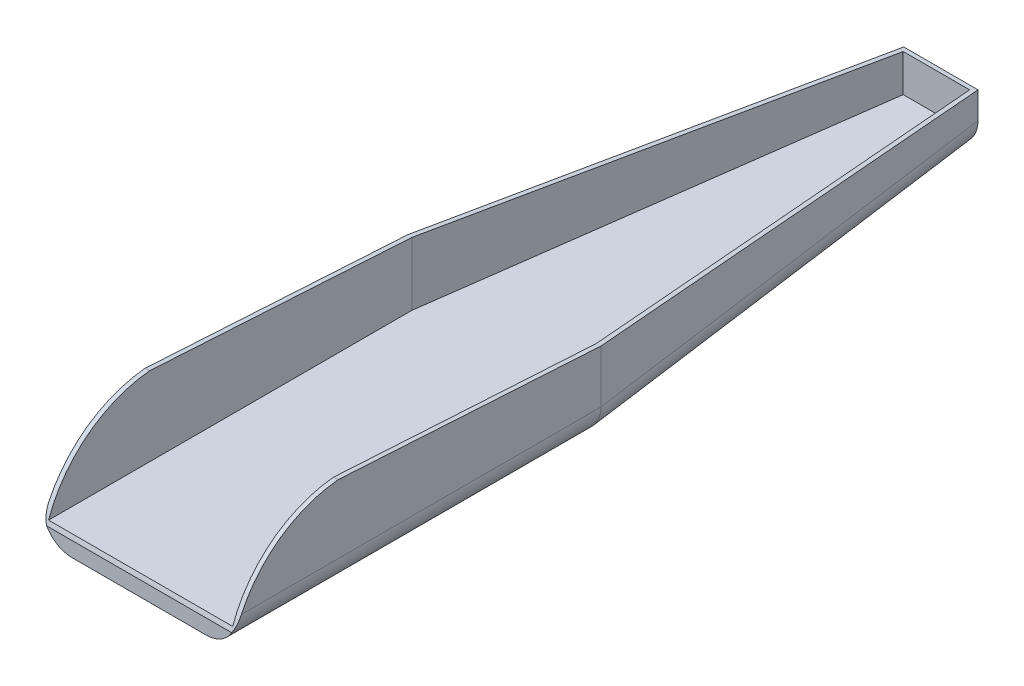
ISO-10303-21;
HEADER;
FILE_DESCRIPTION(('STEP AP214'),'2;1');
FILE_NAME('part.step','',(''),(''),'','','');
FILE_SCHEMA(('AUTOMOTIVE_DESIGN { 1 0 10303 214 1 1 1 1 }'));
ENDSEC;
DATA;
#1=APPLICATION_CONTEXT('core data for automotive mechanical design processes');
#2=APPLICATION_PROTOCOL_DEFINITION('international standard','automotive_design',2000,#1);
#3=PRODUCT_CONTEXT('',#1,'mechanical');
#4=PRODUCT('Part','Part','',(#3));
#5=PRODUCT_RELATED_PRODUCT_CATEGORY('part','',(#4));
#6=PRODUCT_DEFINITION_FORMATION('','',#4);
#7=PRODUCT_DEFINITION_CONTEXT('part definition',#1,'design');
#8=PRODUCT_DEFINITION('design','',#6,#7);
#9=PRODUCT_DEFINITION_SHAPE('','',#8);
#10=(LENGTH_UNIT() NAMED_UNIT(*) SI_UNIT(.MILLI.,.METRE.));
#11=(NAMED_UNIT(*) PLANE_ANGLE_UNIT() SI_UNIT($,.RADIAN.));
#12=(NAMED_UNIT(*) SI_UNIT($,.STERADIAN.) SOLID_ANGLE_UNIT());
#13=UNCERTAINTY_MEASURE_WITH_UNIT(LENGTH_MEASURE(1.E-05),#10,'distance_accuracy_value','');
#14=(GEOMETRIC_REPRESENTATION_CONTEXT(3) GLOBAL_UNCERTAINTY_ASSIGNED_CONTEXT((#13)) GLOBAL_UNIT_ASSIGNED_CONTEXT((#10,
#11,#12)) REPRESENTATION_CONTEXT('',''));
#15=CARTESIAN_POINT('',(0.,0.,0.));
#16=DIRECTION('',(0.,0.,1.));
#17=DIRECTION('',(1.,0.,0.));
#18=AXIS2_PLACEMENT_3D('',#15,#16,#17);
#19=CARTESIAN_POINT('',(65.,14.,-168.721431752641));
#20=DIRECTION('',(0.,-0.998225338463608,0.0595497577595068));
#21=DIRECTION('',(0.,-0.0595497577595068,-0.998225338463608));
#22=AXIS2_PLACEMENT_3D('',#19,#20,#21);
#23=PLANE('',#22);
#24=DIRECTION('',(0.,0.0595497577595068,0.998225338463608));
#25=VECTOR('',#24,1.);
#26=CARTESIAN_POINT('',(1.5,27.6860779785024,60.6966269656402));
#27=LINE('',#26,#25);
#28=CARTESIAN_POINT('',(1.5,22.7754364631342,-21.6198588301278));
#29=VERTEX_POINT('',#28);
#30=CARTESIAN_POINT('',(1.5,28.050095,66.798599973799));
#31=VERTEX_POINT('',#30);
#32=EDGE_CURVE('E187',#29,#31,#27,.T.);
#33=ORIENTED_EDGE('',*,*,#32,.F.);
#34=DIRECTION('',(-0.134577490464757,0.0590080379296326,0.989144554915965));
#35=VECTOR('',#34,1.);
#36=CARTESIAN_POINT('',(22.3014020507531,13.654669558049,-174.510163903163));
#37=LINE('',#36,#35);
#38=CARTESIAN_POINT('',(21.3097378125868,14.0894834394574,-167.221431752641));
#39=VERTEX_POINT('',#38);
#40=EDGE_CURVE('E192',#39,#29,#37,.T.);
#41=ORIENTED_EDGE('',*,*,#40,.F.);
#42=DIRECTION('',(-1.,0.,0.));
#43=VECTOR('',#42,1.);
#44=CARTESIAN_POINT('',(65.,14.0894834394574,-167.221431752641));
#45=LINE('',#44,#43);
#46=CARTESIAN_POINT('',(43.6902621874132,14.0894834394574,-167.221431752641));
#47=VERTEX_POINT('',#46);
#48=EDGE_CURVE('E189',#47,#39,#45,.T.);
#49=ORIENTED_EDGE('',*,*,#48,.F.);
#50=DIRECTION('',(0.134577490464757,0.0590080379296326,0.989144554915965));
#51=VECTOR('',#50,1.);
#52=CARTESIAN_POINT('',(43.8758195103333,14.1708445460673,-165.857585429178));
#53=LINE('',#52,#51);
#54=CARTESIAN_POINT('',(63.5,22.7754364631342,-21.6198588301278));
#55=VERTEX_POINT('',#54);
#56=EDGE_CURVE('E170',#47,#55,#53,.T.);
#57=ORIENTED_EDGE('',*,*,#56,.T.);
#58=DIRECTION('',(0.,0.0595497577595068,0.998225338463608));
#59=VECTOR('',#58,1.);
#60=CARTESIAN_POINT('',(63.5,27.6860779785024,60.6966269656402));
#61=LINE('',#60,#59);
#62=CARTESIAN_POINT('',(63.5,28.050095,66.798599973799));
#63=VERTEX_POINT('',#62);
#64=EDGE_CURVE('E159',#55,#63,#61,.T.);
#65=ORIENTED_EDGE('',*,*,#64,.T.);
#66=DIRECTION('',(-1.,0.,0.));
#67=VECTOR('',#66,1.);
#68=CARTESIAN_POINT('',(65.,28.050095,66.798599973799));
#69=LINE('',#68,#67);
#70=CARTESIAN_POINT('',(65.,28.050095,66.798599973799));
#71=VERTEX_POINT('',#70);
#72=EDGE_CURVE('E219',#71,#63,#69,.T.);
#73=ORIENTED_EDGE('',*,*,#72,.F.);
#74=DIRECTION('',(0.,0.0595497577595068,0.998225338463608));
#75=VECTOR('',#74,1.);
#76=CARTESIAN_POINT('',(65.,14.,-168.721431752641));
#77=LINE('',#76,#75);
#78=CARTESIAN_POINT('',(65.,22.7693770668261,-21.7214317526408));
#79=VERTEX_POINT('',#78);
#80=EDGE_CURVE('E211',#79,#71,#77,.T.);
#81=ORIENTED_EDGE('',*,*,#80,.F.);
#82=DIRECTION('',(0.134577490464757,0.0590080379296326,0.989144554915965));
#83=VECTOR('',#82,1.);
#84=CARTESIAN_POINT('',(45.3622220187958,14.1588230732364,-166.059099914491));
#85=LINE('',#84,#83);
#86=CARTESIAN_POINT('',(45.,14.,-168.721431752641));
#87=VERTEX_POINT('',#86);
#88=EDGE_CURVE('E178',#87,#79,#85,.T.);
#89=ORIENTED_EDGE('',*,*,#88,.F.);
#90=DIRECTION('',(-1.,0.,0.));
#91=VECTOR('',#90,1.);
#92=CARTESIAN_POINT('',(65.,14.,-168.721431752641));
#93=LINE('',#92,#91);
#94=CARTESIAN_POINT('',(20.,14.,-168.721431752641));
#95=VERTEX_POINT('',#94);
#96=EDGE_CURVE('E222',#87,#95,#93,.T.);
#97=ORIENTED_EDGE('',*,*,#96,.T.);
#98=DIRECTION('',(-0.134577490464757,0.0590080379296326,0.989144554915965));
#99=VECTOR('',#98,1.);
#100=CARTESIAN_POINT('',(20.8149995422906,13.6426480852181,-174.711678388477));
#101=LINE('',#100,#99);
#102=CARTESIAN_POINT('',(0.,22.7693770668261,-21.7214317526409));
#103=VERTEX_POINT('',#102);
#104=EDGE_CURVE('E204',#95,#103,#101,.T.);
#105=ORIENTED_EDGE('',*,*,#104,.T.);
#106=DIRECTION('',(0.,0.0595497577595068,0.998225338463608));
#107=VECTOR('',#106,1.);
#108=CARTESIAN_POINT('',(0.,14.,-168.721431752641));
#109=LINE('',#108,#107);
#110=CARTESIAN_POINT('',(0.,28.050095,66.798599973799));
#111=VERTEX_POINT('',#110);
#112=EDGE_CURVE('E212',#103,#111,#109,.T.);
#113=ORIENTED_EDGE('',*,*,#112,.T.);
#114=EDGE_CURVE('E214',#31,#111,#69,.T.);
#115=ORIENTED_EDGE('',*,*,#114,.F.);
#116=EDGE_LOOP('',(#33,#41,#49,#57,#65,#73,#81,#89,#97,#105,#113,#115));
#117=FACE_BOUND('',#116,.T.);
#118=ADVANCED_FACE('F35',(#117),#23,.F.);
#119=CARTESIAN_POINT('',(65.,-11.7739276926699,63.0506383179505));
#120=DIRECTION('',(-1.,0.,0.));
#121=DIRECTION('',(0.,0.,1.));
#122=AXIS2_PLACEMENT_3D('',#119,#120,#121);
#123=CYLINDRICAL_SURFACE('',#122,40.);
#124=DIRECTION('',(-1.,0.,0.));
#125=VECTOR('',#124,1.);
#126=CARTESIAN_POINT('',(65.,0.,101.278568247359));
#127=LINE('',#126,#125);
#128=CARTESIAN_POINT('',(63.6602540378444,0.,101.278568247359));
#129=VERTEX_POINT('',#128);
#130=CARTESIAN_POINT('',(1.33974596215561,0.,101.278568247359));
#131=VERTEX_POINT('',#130);
#132=EDGE_CURVE('E225',#129,#131,#127,.T.);
#133=ORIENTED_EDGE('',*,*,#132,.F.);
#134=CARTESIAN_POINT('',(63.6602540378444,0.,101.278568247359));
#135=CARTESIAN_POINT('',(63.7338899158585,0.12754007005684,101.239287679407));
#136=CARTESIAN_POINT('',(63.804546085549,0.256429020665724,101.198890837788));
#137=CARTESIAN_POINT('',(63.9398415163846,0.516615434185572,101.115861187733));
#138=CARTESIAN_POINT('',(64.0044810185242,0.647912800376325,101.073228468961));
#139=CARTESIAN_POINT('',(64.189245170949,1.04488828939588,100.942003173469));
#140=CARTESIAN_POINT('',(64.3002772532406,1.31375714013071,100.850050553617));
#141=CARTESIAN_POINT('',(64.4956510645759,1.85154363724783,100.659496994956));
#142=CARTESIAN_POINT('',(64.5805061462836,2.12034074824332,100.561077091553));
#143=CARTESIAN_POINT('',(64.7266912202448,2.66121792505422,100.356269336485));
#144=CARTESIAN_POINT('',(64.7880277056041,2.93329706332702,100.249883693742));
#145=CARTESIAN_POINT('',(64.8648809774044,3.3546974684828,100.079687957632));
#146=CARTESIAN_POINT('',(64.8885550895193,3.50364093211374,100.018489392526));
#147=CARTESIAN_POINT('',(64.92906130204,3.80153429373515,99.8939686600661));
#148=CARTESIAN_POINT('',(64.9458948973224,3.95048418319806,99.8306469599637));
#149=CARTESIAN_POINT('',(64.986590194721,4.40043516841057,99.6361253445722));
#150=CARTESIAN_POINT('',(65.0000163163142,4.70105698257816,99.5017731107779));
#151=CARTESIAN_POINT('',(65.,5.,99.3636573298845));
#152=B_SPLINE_CURVE_WITH_KNOTS('',3,(#134,#135,#136,#137,#138,#139,#140,#141,#142,#143,#144,
#145,#146,#147,#148,#149,#150,#151),.UNSPECIFIED.,.F.,.F.,(4,2,2,2,2,2,2,2,4),(0.,
0.457174194779168,0.914330069798578,1.82825877196832,2.72291940942083,3.6173328673198,
4.10546674891732,4.5934938998533,5.58092390810719),.UNSPECIFIED.);
#153=CARTESIAN_POINT('',(65.,5.,99.3636573298845));
#154=VERTEX_POINT('',#153);
#155=EDGE_CURVE('E252',#129,#154,#152,.T.);
#156=ORIENTED_EDGE('',*,*,#155,.T.);
#157=CARTESIAN_POINT('',(65.,-11.7739276926699,63.0506383179505));
#158=DIRECTION('',(1.,0.,0.));
#159=DIRECTION('',(0.,0.,1.));
#160=AXIS2_PLACEMENT_3D('',#157,#158,#159);
#161=CIRCLE('',#160,40.);
#162=EDGE_CURVE('E208',#71,#154,#161,.T.);
#163=ORIENTED_EDGE('',*,*,#162,.F.);
#164=ORIENTED_EDGE('',*,*,#72,.T.);
#165=CARTESIAN_POINT('',(63.5,-11.7739276926699,63.0506383179505));
#166=DIRECTION('',(-1.,0.,0.));
#167=DIRECTION('',(0.,0.,1.));
#168=AXIS2_PLACEMENT_3D('',#165,#166,#167);
#169=CIRCLE('',#168,40.);
#170=CARTESIAN_POINT('',(63.5,1.5,100.783950438804));
#171=VERTEX_POINT('',#170);
#172=EDGE_CURVE('E160',#63,#171,#169,.F.);
#173=ORIENTED_EDGE('',*,*,#172,.T.);
#174=DIRECTION('',(-1.,0.,0.));
#175=VECTOR('',#174,1.);
#176=CARTESIAN_POINT('',(63.5,1.5,100.783950438804));
#177=LINE('',#176,#175);
#178=CARTESIAN_POINT('',(1.5,1.5,100.783950438804));
#179=VERTEX_POINT('',#178);
#180=EDGE_CURVE('E155',#171,#179,#177,.T.);
#181=ORIENTED_EDGE('',*,*,#180,.T.);
#182=CARTESIAN_POINT('',(1.5,-11.7739276926699,63.0506383179505));
#183=DIRECTION('',(-1.,0.,0.));
#184=DIRECTION('',(0.,0.,1.));
#185=AXIS2_PLACEMENT_3D('',#182,#183,#184);
#186=CIRCLE('',#185,40.);
#187=EDGE_CURVE('E197',#31,#179,#186,.F.);
#188=ORIENTED_EDGE('',*,*,#187,.F.);
#189=ORIENTED_EDGE('',*,*,#114,.T.);
#190=CARTESIAN_POINT('',(0.,-11.7739276926699,63.0506383179505));
#191=DIRECTION('',(1.,0.,0.));
#192=DIRECTION('',(0.,0.,1.));
#193=AXIS2_PLACEMENT_3D('',#190,#191,#192);
#194=CIRCLE('',#193,40.);
#195=CARTESIAN_POINT('',(0.,5.,99.3636573298845));
#196=VERTEX_POINT('',#195);
#197=EDGE_CURVE('E207',#111,#196,#194,.T.);
#198=ORIENTED_EDGE('',*,*,#197,.T.);
#199=CARTESIAN_POINT('',(0.,5.,99.3636573298845));
#200=CARTESIAN_POINT('',(-2.53665102290556E-05,4.7232804938109,99.4915166758296));
#201=CARTESIAN_POINT('',(0.0114867534885504,4.44501981822944,99.6161798672259));
#202=CARTESIAN_POINT('',(0.0581725158669353,3.8871917503572,99.8585342646588));
#203=CARTESIAN_POINT('',(0.0933651281186932,3.60762348903121,99.9762197987561));
#204=CARTESIAN_POINT('',(0.186965802333407,3.0555082948481,100.201343800638));
#205=CARTESIAN_POINT('',(0.244849485112531,2.78294148532774,100.308950047035));
#206=CARTESIAN_POINT('',(0.384074508985962,2.24097427204304,100.516177492166));
#207=CARTESIAN_POINT('',(0.465402382293354,1.97157214250456,100.615803233524));
#208=CARTESIAN_POINT('',(0.660009069759501,1.41400889529034,100.815352173708));
#209=CARTESIAN_POINT('',(0.775499458552295,1.12633263925035,100.914500510818));
#210=CARTESIAN_POINT('',(0.970257848237401,0.700164129280331,101.056162615467));
#211=CARTESIAN_POINT('',(1.03925096416579,0.558152218047546,101.102466090355));
#212=CARTESIAN_POINT('',(1.18425340981084,0.276903523653424,101.192469369443));
#213=CARTESIAN_POINT('',(1.26026308919194,0.137666879216016,101.236169043706));
#214=CARTESIAN_POINT('',(1.33974596215561,0.,101.278568247359));
#215=B_SPLINE_CURVE_WITH_KNOTS('',3,(#199,#200,#201,#202,#203,#204,#205,#206,#207,#208,#209,
#210,#211,#212,#213,#214),.UNSPECIFIED.,.F.,.F.,(4,2,2,2,2,2,2,4),(0.,0.914341704346828,
1.82941673919767,2.72448556016526,3.6190412196628,4.59383577171789,5.08727046369472,
5.58072975885575),.UNSPECIFIED.);
#216=EDGE_CURVE('E246',#196,#131,#215,.T.);
#217=ORIENTED_EDGE('',*,*,#216,.T.);
#218=EDGE_LOOP('',(#133,#156,#163,#164,#173,#181,#188,#189,#198,#217));
#219=FACE_BOUND('',#218,.T.);
#220=ADVANCED_FACE('F261',(#219),#123,.T.);
#221=CARTESIAN_POINT('',(65.,0.,-168.721431752641));
#222=DIRECTION('',(0.,0.,1.));
#223=DIRECTION('',(1.,0.,0.));
#224=AXIS2_PLACEMENT_3D('',#221,#222,#223);
#225=PLANE('',#224);
#226=DIRECTION('',(1.,0.,0.));
#227=VECTOR('',#226,1.);
#228=CARTESIAN_POINT('',(45.,-5.,-168.721431752641));
#229=LINE('',#228,#227);
#230=CARTESIAN_POINT('',(30.0921296349324,-5.,-168.721431752641));
#231=VERTEX_POINT('',#230);
#232=CARTESIAN_POINT('',(34.9078703650676,-5.,-168.721431752641));
#233=VERTEX_POINT('',#232);
#234=EDGE_CURVE('E333',#231,#233,#229,.T.);
#235=ORIENTED_EDGE('',*,*,#234,.F.);
#236=CARTESIAN_POINT('',(30.0921296349324,5.,-168.721431752641));
#237=DIRECTION('',(0.,0.,1.));
#238=DIRECTION('',(1.,0.,0.));
#239=AXIS2_PLACEMENT_3D('',#236,#237,#238);
#240=ELLIPSE('',#239,10.0921296349324,10.);
#241=CARTESIAN_POINT('',(20.,5.,-168.721431752641));
#242=VERTEX_POINT('',#241);
#243=EDGE_CURVE('E52',#231,#242,#240,.F.);
#244=ORIENTED_EDGE('',*,*,#243,.T.);
#245=DIRECTION('',(0.,1.,0.));
#246=VECTOR('',#245,1.);
#247=CARTESIAN_POINT('',(20.,-348.908583634178,-168.721431752641));
#248=LINE('',#247,#246);
#249=EDGE_CURVE('E202',#242,#95,#248,.T.);
#250=ORIENTED_EDGE('',*,*,#249,.T.);
#251=ORIENTED_EDGE('',*,*,#96,.F.);
#252=DIRECTION('',(0.,1.,0.));
#253=VECTOR('',#252,1.);
#254=CARTESIAN_POINT('',(45.,-348.908583634178,-168.721431752641));
#255=LINE('',#254,#253);
#256=CARTESIAN_POINT('',(45.,5.,-168.721431752641));
#257=VERTEX_POINT('',#256);
#258=EDGE_CURVE('E175',#257,#87,#255,.T.);
#259=ORIENTED_EDGE('',*,*,#258,.F.);
#260=CARTESIAN_POINT('',(34.9078703650676,5.,-168.721431752641));
#261=DIRECTION('',(0.,0.,1.));
#262=DIRECTION('',(-1.,0.,0.));
#263=AXIS2_PLACEMENT_3D('',#260,#261,#262);
#264=ELLIPSE('',#263,10.0921296349324,10.);
#265=EDGE_CURVE('E362',#257,#233,#264,.F.);
#266=ORIENTED_EDGE('',*,*,#265,.T.);
#267=EDGE_LOOP('',(#235,#244,#250,#251,#259,#266));
#268=FACE_BOUND('',#267,.T.);
#269=ADVANCED_FACE('F265',(#268),#225,.F.);
#270=CARTESIAN_POINT('',(65.,-11.7739276926699,63.0506383179505));
#271=DIRECTION('',(-1.,0.,0.));
#272=DIRECTION('',(0.,0.,1.));
#273=AXIS2_PLACEMENT_3D('',#270,#271,#272);
#274=PLANE('',#273);
#275=ORIENTED_EDGE('',*,*,#162,.T.);
#276=DIRECTION('',(0.,0.,1.));
#277=VECTOR('',#276,1.);
#278=CARTESIAN_POINT('',(65.,5.,63.0506383179505));
#279=LINE('',#278,#277);
#280=CARTESIAN_POINT('',(65.,5.,-21.7214317526409));
#281=VERTEX_POINT('',#280);
#282=EDGE_CURVE('E358',#154,#281,#279,.F.);
#283=ORIENTED_EDGE('',*,*,#282,.T.);
#284=DIRECTION('',(0.,-1.,0.));
#285=VECTOR('',#284,1.);
#286=CARTESIAN_POINT('',(65.,-11.7739276926699,-21.7214317526409));
#287=LINE('',#286,#285);
#288=EDGE_CURVE('E230',#79,#281,#287,.T.);
#289=ORIENTED_EDGE('',*,*,#288,.F.);
#290=ORIENTED_EDGE('',*,*,#80,.T.);
#291=EDGE_LOOP('',(#275,#283,#289,#290));
#292=FACE_BOUND('',#291,.T.);
#293=ADVANCED_FACE('F294',(#292),#274,.F.);
#294=CARTESIAN_POINT('',(0.,-11.7739276926699,63.0506383179505));
#295=DIRECTION('',(-1.,0.,0.));
#296=DIRECTION('',(0.,0.,1.));
#297=AXIS2_PLACEMENT_3D('',#294,#295,#296);
#298=PLANE('',#297);
#299=DIRECTION('',(0.,1.,0.));
#300=VECTOR('',#299,1.);
#301=CARTESIAN_POINT('',(0.,-11.7739276926699,-21.7214317526409));
#302=LINE('',#301,#300);
#303=CARTESIAN_POINT('',(0.,5.,-21.7214317526409));
#304=VERTEX_POINT('',#303);
#305=EDGE_CURVE('E228',#304,#103,#302,.T.);
#306=ORIENTED_EDGE('',*,*,#305,.F.);
#307=DIRECTION('',(0.,0.,-1.));
#308=VECTOR('',#307,1.);
#309=CARTESIAN_POINT('',(0.,5.,101.278568247359));
#310=LINE('',#309,#308);
#311=EDGE_CURVE('E361',#304,#196,#310,.F.);
#312=ORIENTED_EDGE('',*,*,#311,.T.);
#313=ORIENTED_EDGE('',*,*,#197,.F.);
#314=ORIENTED_EDGE('',*,*,#112,.F.);
#315=EDGE_LOOP('',(#306,#312,#313,#314));
#316=FACE_BOUND('',#315,.T.);
#317=ADVANCED_FACE('F290',(#316),#298,.T.);
#318=CARTESIAN_POINT('',(0.,-348.908583634178,-21.7214317526409));
#319=DIRECTION('',(0.990871140357378,0.,0.134812400048623));
#320=DIRECTION('',(0.134812400048623,0.,-0.990871140357378));
#321=AXIS2_PLACEMENT_3D('',#318,#319,#320);
#322=PLANE('',#321);
#323=ORIENTED_EDGE('',*,*,#249,.F.);
#324=DIRECTION('',(0.134812400048623,0.,-0.990871140357378));
#325=VECTOR('',#324,1.);
#326=CARTESIAN_POINT('',(0.,5.,-21.7214317526409));
#327=LINE('',#326,#325);
#328=EDGE_CURVE('E44',#242,#304,#327,.F.);
#329=ORIENTED_EDGE('',*,*,#328,.T.);
#330=ORIENTED_EDGE('',*,*,#305,.T.);
#331=ORIENTED_EDGE('',*,*,#104,.F.);
#332=EDGE_LOOP('',(#323,#329,#330,#331));
#333=FACE_BOUND('',#332,.T.);
#334=ADVANCED_FACE('F293',(#333),#322,.F.);
#335=CARTESIAN_POINT('',(65.,-348.908583634178,-21.7214317526409));
#336=DIRECTION('',(0.990871140357378,0.,-0.134812400048623));
#337=DIRECTION('',(-0.134812400048623,0.,-0.990871140357378));
#338=AXIS2_PLACEMENT_3D('',#335,#336,#337);
#339=PLANE('',#338);
#340=ORIENTED_EDGE('',*,*,#288,.T.);
#341=DIRECTION('',(0.134812400048623,0.,0.990871140357378));
#342=VECTOR('',#341,1.);
#343=CARTESIAN_POINT('',(45.,5.,-168.721431752641));
#344=LINE('',#343,#342);
#345=EDGE_CURVE('E11',#281,#257,#344,.F.);
#346=ORIENTED_EDGE('',*,*,#345,.T.);
#347=ORIENTED_EDGE('',*,*,#258,.T.);
#348=ORIENTED_EDGE('',*,*,#88,.T.);
#349=EDGE_LOOP('',(#340,#346,#347,#348));
#350=FACE_BOUND('',#349,.T.);
#351=ADVANCED_FACE('F301',(#350),#339,.T.);
#352=CARTESIAN_POINT('',(65.,1.5,101.278568247359));
#353=DIRECTION('',(0.,1.,0.));
#354=DIRECTION('',(0.,0.,1.));
#355=AXIS2_PLACEMENT_3D('',#352,#353,#354);
#356=PLANE('',#355);
#357=DIRECTION('',(-0.134812400048623,0.,-0.990871140357378));
#358=VECTOR('',#357,1.);
#359=CARTESIAN_POINT('',(79.9442444276347,1.5,99.2453377129871));
#360=LINE('',#359,#358);
#361=CARTESIAN_POINT('',(63.5,1.5,-21.6198588301278));
#362=VERTEX_POINT('',#361);
#363=CARTESIAN_POINT('',(43.6902621874132,1.5,-167.221431752641));
#364=VERTEX_POINT('',#363);
#365=EDGE_CURVE('E153',#362,#364,#360,.T.);
#366=ORIENTED_EDGE('',*,*,#365,.T.);
#367=DIRECTION('',(-1.,0.,0.));
#368=VECTOR('',#367,1.);
#369=CARTESIAN_POINT('',(65.,1.5,-167.221431752641));
#370=LINE('',#369,#368);
#371=CARTESIAN_POINT('',(21.3097378125868,1.5,-167.221431752641));
#372=VERTEX_POINT('',#371);
#373=EDGE_CURVE('E185',#364,#372,#370,.T.);
#374=ORIENTED_EDGE('',*,*,#373,.T.);
#375=DIRECTION('',(0.134812400048623,0.,-0.990871140357378));
#376=VECTOR('',#375,1.);
#377=CARTESIAN_POINT('',(-13.7629095191881,1.5,90.562526135905));
#378=LINE('',#377,#376);
#379=CARTESIAN_POINT('',(1.5,1.5,-21.6198588301278));
#380=VERTEX_POINT('',#379);
#381=EDGE_CURVE('E194',#380,#372,#378,.T.);
#382=ORIENTED_EDGE('',*,*,#381,.F.);
#383=DIRECTION('',(0.,0.,-1.));
#384=VECTOR('',#383,1.);
#385=CARTESIAN_POINT('',(1.5,1.5,63.0506383179505));
#386=LINE('',#385,#384);
#387=EDGE_CURVE('E196',#179,#380,#386,.T.);
#388=ORIENTED_EDGE('',*,*,#387,.F.);
#389=ORIENTED_EDGE('',*,*,#180,.F.);
#390=DIRECTION('',(0.,0.,-1.));
#391=VECTOR('',#390,1.);
#392=CARTESIAN_POINT('',(63.5,1.5,63.0506383179505));
#393=LINE('',#392,#391);
#394=EDGE_CURVE('E150',#171,#362,#393,.T.);
#395=ORIENTED_EDGE('',*,*,#394,.T.);
#396=EDGE_LOOP('',(#366,#374,#382,#388,#389,#395));
#397=FACE_BOUND('',#396,.T.);
#398=ADVANCED_FACE('F152',(#397),#356,.T.);
#399=CARTESIAN_POINT('',(65.,0.,-167.221431752641));
#400=DIRECTION('',(0.,0.,1.));
#401=DIRECTION('',(1.,0.,0.));
#402=AXIS2_PLACEMENT_3D('',#399,#400,#401);
#403=PLANE('',#402);
#404=DIRECTION('',(0.,1.,0.));
#405=VECTOR('',#404,1.);
#406=CARTESIAN_POINT('',(43.6902621874132,0.,-167.221431752641));
#407=LINE('',#406,#405);
#408=EDGE_CURVE('E167',#364,#47,#407,.T.);
#409=ORIENTED_EDGE('',*,*,#408,.T.);
#410=ORIENTED_EDGE('',*,*,#48,.T.);
#411=DIRECTION('',(0.,1.,0.));
#412=VECTOR('',#411,1.);
#413=CARTESIAN_POINT('',(21.3097378125868,0.,-167.221431752641));
#414=LINE('',#413,#412);
#415=EDGE_CURVE('E169',#372,#39,#414,.T.);
#416=ORIENTED_EDGE('',*,*,#415,.F.);
#417=ORIENTED_EDGE('',*,*,#373,.F.);
#418=EDGE_LOOP('',(#409,#410,#416,#417));
#419=FACE_BOUND('',#418,.T.);
#420=ADVANCED_FACE('F317',(#419),#403,.T.);
#421=CARTESIAN_POINT('',(63.5,-11.7739276926699,63.0506383179505));
#422=DIRECTION('',(-1.,0.,0.));
#423=DIRECTION('',(0.,0.,1.));
#424=AXIS2_PLACEMENT_3D('',#421,#422,#423);
#425=PLANE('',#424);
#426=DIRECTION('',(0.,-1.,0.));
#427=VECTOR('',#426,1.);
#428=CARTESIAN_POINT('',(63.5,-11.7739276926699,-21.6198588301279));
#429=LINE('',#428,#427);
#430=EDGE_CURVE('E164',#55,#362,#429,.T.);
#431=ORIENTED_EDGE('',*,*,#430,.T.);
#432=ORIENTED_EDGE('',*,*,#394,.F.);
#433=ORIENTED_EDGE('',*,*,#172,.F.);
#434=ORIENTED_EDGE('',*,*,#64,.F.);
#435=EDGE_LOOP('',(#431,#432,#433,#434));
#436=FACE_BOUND('',#435,.T.);
#437=ADVANCED_FACE('F172',(#436),#425,.T.);
#438=CARTESIAN_POINT('',(1.5,-11.7739276926699,63.0506383179505));
#439=DIRECTION('',(-1.,0.,0.));
#440=DIRECTION('',(0.,0.,1.));
#441=AXIS2_PLACEMENT_3D('',#438,#439,#440);
#442=PLANE('',#441);
#443=DIRECTION('',(0.,1.,0.));
#444=VECTOR('',#443,1.);
#445=CARTESIAN_POINT('',(1.5,-11.7739276926699,-21.6198588301279));
#446=LINE('',#445,#444);
#447=EDGE_CURVE('E176',#380,#29,#446,.T.);
#448=ORIENTED_EDGE('',*,*,#447,.T.);
#449=ORIENTED_EDGE('',*,*,#32,.T.);
#450=ORIENTED_EDGE('',*,*,#187,.T.);
#451=ORIENTED_EDGE('',*,*,#387,.T.);
#452=EDGE_LOOP('',(#448,#449,#450,#451));
#453=FACE_BOUND('',#452,.T.);
#454=ADVANCED_FACE('F310',(#453),#442,.F.);
#455=CARTESIAN_POINT('',(1.48630671053607,-348.908583634178,-21.5192131525679));
#456=DIRECTION('',(0.990871140357378,0.,0.134812400048623));
#457=DIRECTION('',(0.134812400048623,0.,-0.990871140357378));
#458=AXIS2_PLACEMENT_3D('',#455,#456,#457);
#459=PLANE('',#458);
#460=ORIENTED_EDGE('',*,*,#381,.T.);
#461=ORIENTED_EDGE('',*,*,#415,.T.);
#462=ORIENTED_EDGE('',*,*,#40,.T.);
#463=ORIENTED_EDGE('',*,*,#447,.F.);
#464=EDGE_LOOP('',(#460,#461,#462,#463));
#465=FACE_BOUND('',#464,.T.);
#466=ADVANCED_FACE('F307',(#465),#459,.T.);
#467=CARTESIAN_POINT('',(63.5136932894639,-348.908583634178,-21.5192131525679));
#468=DIRECTION('',(0.990871140357378,0.,-0.134812400048623));
#469=DIRECTION('',(-0.134812400048623,0.,-0.990871140357378));
#470=AXIS2_PLACEMENT_3D('',#467,#468,#469);
#471=PLANE('',#470);
#472=ORIENTED_EDGE('',*,*,#430,.F.);
#473=ORIENTED_EDGE('',*,*,#56,.F.);
#474=ORIENTED_EDGE('',*,*,#408,.F.);
#475=ORIENTED_EDGE('',*,*,#365,.F.);
#476=EDGE_LOOP('',(#472,#473,#474,#475));
#477=FACE_BOUND('',#476,.T.);
#478=ADVANCED_FACE('F163',(#477),#471,.F.);
#479=CARTESIAN_POINT('',(65.,-5.,101.278568247359));
#480=DIRECTION('',(0.,0.,-1.));
#481=DIRECTION('',(-1.,0.,0.));
#482=AXIS2_PLACEMENT_3D('',#479,#480,#481);
#483=PLANE('',#482);
#484=DIRECTION('',(-1.,0.,0.));
#485=VECTOR('',#484,1.);
#486=CARTESIAN_POINT('',(65.,-5.,101.278568247359));
#487=LINE('',#486,#485);
#488=CARTESIAN_POINT('',(55.,-5.,101.278568247359));
#489=VERTEX_POINT('',#488);
#490=CARTESIAN_POINT('',(10.,-5.,101.278568247359));
#491=VERTEX_POINT('',#490);
#492=EDGE_CURVE('E329',#489,#491,#487,.T.);
#493=ORIENTED_EDGE('',*,*,#492,.F.);
#494=CARTESIAN_POINT('',(55.,5.,101.278568247359));
#495=DIRECTION('',(0.,0.,-1.));
#496=DIRECTION('',(-1.,0.,0.));
#497=AXIS2_PLACEMENT_3D('',#494,#495,#496);
#498=CIRCLE('',#497,10.);
#499=EDGE_CURVE('E244',#489,#129,#498,.F.);
#500=ORIENTED_EDGE('',*,*,#499,.T.);
#501=ORIENTED_EDGE('',*,*,#132,.T.);
#502=CARTESIAN_POINT('',(10.,5.,101.278568247359));
#503=DIRECTION('',(0.,0.,-1.));
#504=DIRECTION('',(-1.,0.,0.));
#505=AXIS2_PLACEMENT_3D('',#502,#503,#504);
#506=CIRCLE('',#505,10.);
#507=EDGE_CURVE('E242',#131,#491,#506,.F.);
#508=ORIENTED_EDGE('',*,*,#507,.T.);
#509=EDGE_LOOP('',(#493,#500,#501,#508));
#510=FACE_BOUND('',#509,.T.);
#511=ADVANCED_FACE('F280',(#510),#483,.F.);
#512=CARTESIAN_POINT('',(0.,-5.,0.));
#513=DIRECTION('',(0.,1.,0.));
#514=DIRECTION('',(0.,0.,1.));
#515=AXIS2_PLACEMENT_3D('',#512,#513,#514);
#516=PLANE('',#515);
#517=ORIENTED_EDGE('',*,*,#492,.T.);
#518=DIRECTION('',(0.,0.,-1.));
#519=VECTOR('',#518,1.);
#520=CARTESIAN_POINT('',(10.,-5.,-21.7214317526409));
#521=LINE('',#520,#519);
#522=CARTESIAN_POINT('',(10.,-5.,-21.0442789358874));
#523=VERTEX_POINT('',#522);
#524=EDGE_CURVE('E239',#491,#523,#521,.T.);
#525=ORIENTED_EDGE('',*,*,#524,.T.);
#526=DIRECTION('',(0.134812400048623,0.,-0.990871140357378));
#527=VECTOR('',#526,1.);
#528=CARTESIAN_POINT('',(7.00712526368718,-5.,0.953350376011861));
#529=LINE('',#528,#527);
#530=EDGE_CURVE('E237',#523,#231,#529,.T.);
#531=ORIENTED_EDGE('',*,*,#530,.T.);
#532=ORIENTED_EDGE('',*,*,#234,.T.);
#533=DIRECTION('',(0.134812400048623,0.,0.990871140357378));
#534=VECTOR('',#533,1.);
#535=CARTESIAN_POINT('',(55.0912885964262,-5.,-20.3733077521546));
#536=LINE('',#535,#534);
#537=CARTESIAN_POINT('',(55.,-5.,-21.0442789358874));
#538=VERTEX_POINT('',#537);
#539=EDGE_CURVE('E232',#233,#538,#536,.T.);
#540=ORIENTED_EDGE('',*,*,#539,.T.);
#541=DIRECTION('',(0.,0.,1.));
#542=VECTOR('',#541,1.);
#543=CARTESIAN_POINT('',(55.,-5.,0.));
#544=LINE('',#543,#542);
#545=EDGE_CURVE('E234',#538,#489,#544,.T.);
#546=ORIENTED_EDGE('',*,*,#545,.T.);
#547=EDGE_LOOP('',(#517,#525,#531,#532,#540,#546));
#548=FACE_BOUND('',#547,.T.);
#549=ADVANCED_FACE('F275',(#548),#516,.F.);
#550=CARTESIAN_POINT('',(56.8115398278663,5.,-7.72946120107024));
#551=DIRECTION('',(-0.134812400048623,0.,-0.990871140357378));
#552=DIRECTION('',(-0.990871140357378,0.,0.134812400048623));
#553=AXIS2_PLACEMENT_3D('',#550,#551,#552);
#554=CYLINDRICAL_SURFACE('',#553,10.);
#555=ORIENTED_EDGE('',*,*,#265,.F.);
#556=ORIENTED_EDGE('',*,*,#345,.F.);
#557=CARTESIAN_POINT('',(55.,5.,-21.0442789358874));
#558=DIRECTION('',(-0.0675605640985268,0.,-0.997715174876422));
#559=DIRECTION('',(-0.997715174876422,0.,0.0675605640985262));
#560=AXIS2_PLACEMENT_3D('',#557,#558,#559);
#561=ELLIPSE('',#560,10.022900575045,10.);
#562=EDGE_CURVE('E334',#538,#281,#561,.F.);
#563=ORIENTED_EDGE('',*,*,#562,.F.);
#564=ORIENTED_EDGE('',*,*,#539,.F.);
#565=EDGE_LOOP('',(#555,#556,#563,#564));
#566=FACE_BOUND('',#565,.T.);
#567=ADVANCED_FACE('F272',(#566),#554,.T.);
#568=CARTESIAN_POINT('',(55.,5.,0.));
#569=DIRECTION('',(0.,0.,1.));
#570=DIRECTION('',(1.,0.,0.));
#571=AXIS2_PLACEMENT_3D('',#568,#569,#570);
#572=CYLINDRICAL_SURFACE('',#571,10.);
#573=ORIENTED_EDGE('',*,*,#562,.T.);
#574=ORIENTED_EDGE('',*,*,#282,.F.);
#575=ORIENTED_EDGE('',*,*,#155,.F.);
#576=ORIENTED_EDGE('',*,*,#499,.F.);
#577=ORIENTED_EDGE('',*,*,#545,.F.);
#578=EDGE_LOOP('',(#573,#574,#575,#576,#577));
#579=FACE_BOUND('',#578,.T.);
#580=ADVANCED_FACE('F268',(#579),#572,.T.);
#581=CARTESIAN_POINT('',(7.00712526368718,5.,0.953350376011861));
#582=DIRECTION('',(0.134812400048623,0.,-0.990871140357378));
#583=DIRECTION('',(-0.990871140357378,0.,-0.134812400048623));
#584=AXIS2_PLACEMENT_3D('',#581,#582,#583);
#585=CYLINDRICAL_SURFACE('',#584,10.);
#586=ORIENTED_EDGE('',*,*,#243,.F.);
#587=ORIENTED_EDGE('',*,*,#530,.F.);
#588=CARTESIAN_POINT('',(10.,5.,-21.0442789358874));
#589=DIRECTION('',(0.0675605640985268,0.,-0.997715174876422));
#590=DIRECTION('',(0.997715174876422,0.,0.0675605640985262));
#591=AXIS2_PLACEMENT_3D('',#588,#589,#590);
#592=ELLIPSE('',#591,10.022900575045,10.);
#593=EDGE_CURVE('E39',#304,#523,#592,.F.);
#594=ORIENTED_EDGE('',*,*,#593,.F.);
#595=ORIENTED_EDGE('',*,*,#328,.F.);
#596=EDGE_LOOP('',(#586,#587,#594,#595));
#597=FACE_BOUND('',#596,.T.);
#598=ADVANCED_FACE('F37',(#597),#585,.T.);
#599=CARTESIAN_POINT('',(10.,5.,0.));
#600=DIRECTION('',(0.,0.,1.));
#601=DIRECTION('',(1.,0.,0.));
#602=AXIS2_PLACEMENT_3D('',#599,#600,#601);
#603=CYLINDRICAL_SURFACE('',#602,10.);
#604=ORIENTED_EDGE('',*,*,#216,.F.);
#605=ORIENTED_EDGE('',*,*,#311,.F.);
#606=ORIENTED_EDGE('',*,*,#593,.T.);
#607=ORIENTED_EDGE('',*,*,#524,.F.);
#608=ORIENTED_EDGE('',*,*,#507,.F.);
#609=EDGE_LOOP('',(#604,#605,#606,#607,#608));
#610=FACE_BOUND('',#609,.T.);
#611=ADVANCED_FACE('F258',(#610),#603,.T.);
#612=CLOSED_SHELL('',(#118,#220,#269,#293,#317,#334,#351,#398,#420,#437,#454,#466,#478,#511,
#549,#567,#580,#598,#611));
#613=MANIFOLD_SOLID_BREP('B2',#612);
#614=ADVANCED_BREP_SHAPE_REPRESENTATION('',(#18,#613),#14);
#615=SHAPE_DEFINITION_REPRESENTATION(#9,#614);
ENDSEC;
END-ISO-10303-21;
